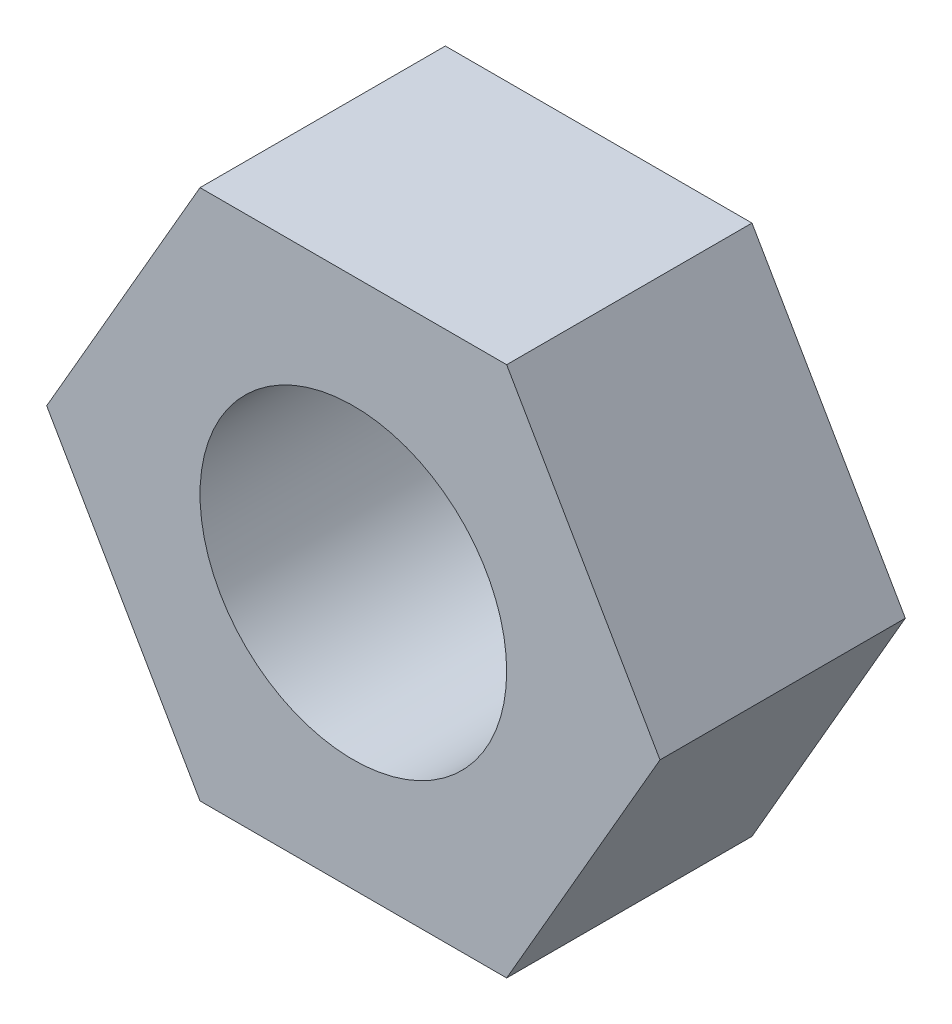
ISO-10303-21;
HEADER;
FILE_DESCRIPTION(('STEP AP214'),'2;1');
FILE_NAME('part.step','',(''),(''),'','','');
FILE_SCHEMA(('AUTOMOTIVE_DESIGN { 1 0 10303 214 1 1 1 1 }'));
ENDSEC;
DATA;
#1=APPLICATION_CONTEXT('core data for automotive mechanical design processes');
#2=APPLICATION_PROTOCOL_DEFINITION('international standard','automotive_design',2000,#1);
#3=PRODUCT_CONTEXT('',#1,'mechanical');
#4=PRODUCT('Part','Part','',(#3));
#5=PRODUCT_RELATED_PRODUCT_CATEGORY('part','',(#4));
#6=PRODUCT_DEFINITION_FORMATION('','',#4);
#7=PRODUCT_DEFINITION_CONTEXT('part definition',#1,'design');
#8=PRODUCT_DEFINITION('design','',#6,#7);
#9=PRODUCT_DEFINITION_SHAPE('','',#8);
#10=(LENGTH_UNIT() NAMED_UNIT(*) SI_UNIT(.MILLI.,.METRE.));
#11=(NAMED_UNIT(*) PLANE_ANGLE_UNIT() SI_UNIT($,.RADIAN.));
#12=(NAMED_UNIT(*) SI_UNIT($,.STERADIAN.) SOLID_ANGLE_UNIT());
#13=UNCERTAINTY_MEASURE_WITH_UNIT(LENGTH_MEASURE(1.E-05),#10,'distance_accuracy_value','');
#14=(GEOMETRIC_REPRESENTATION_CONTEXT(3) GLOBAL_UNCERTAINTY_ASSIGNED_CONTEXT((#13)) GLOBAL_UNIT_ASSIGNED_CONTEXT((#10,
#11,#12)) REPRESENTATION_CONTEXT('',''));
#15=CARTESIAN_POINT('',(0.,0.,0.));
#16=DIRECTION('',(0.,0.,1.));
#17=DIRECTION('',(1.,0.,0.));
#18=AXIS2_PLACEMENT_3D('',#15,#16,#17);
#19=CARTESIAN_POINT('',(2.50000000000005,-4.33012701892216,4.));
#20=DIRECTION('',(-0.866025403784442,0.499999999999995,0.));
#21=DIRECTION('',(-0.499999999999995,-0.866025403784442,0.));
#22=AXIS2_PLACEMENT_3D('',#19,#20,#21);
#23=PLANE('',#22);
#24=DIRECTION('',(0.499999999999995,0.866025403784442,0.));
#25=VECTOR('',#24,1.);
#26=CARTESIAN_POINT('',(2.50000000000005,-4.33012701892216,0.));
#27=LINE('',#26,#25);
#28=CARTESIAN_POINT('',(2.50000000000005,-4.33012701892216,0.));
#29=VERTEX_POINT('',#28);
#30=CARTESIAN_POINT('',(5.,0.,0.));
#31=VERTEX_POINT('',#30);
#32=EDGE_CURVE('E117',#29,#31,#27,.T.);
#33=ORIENTED_EDGE('',*,*,#32,.T.);
#34=DIRECTION('',(0.,0.,-1.));
#35=VECTOR('',#34,1.);
#36=CARTESIAN_POINT('',(5.,0.,4.));
#37=LINE('',#36,#35);
#38=CARTESIAN_POINT('',(5.,0.,4.));
#39=VERTEX_POINT('',#38);
#40=EDGE_CURVE('E11',#39,#31,#37,.T.);
#41=ORIENTED_EDGE('',*,*,#40,.F.);
#42=DIRECTION('',(0.499999999999995,0.866025403784442,0.));
#43=VECTOR('',#42,1.);
#44=CARTESIAN_POINT('',(2.50000000000005,-4.33012701892216,4.));
#45=LINE('',#44,#43);
#46=CARTESIAN_POINT('',(2.50000000000005,-4.33012701892216,4.));
#47=VERTEX_POINT('',#46);
#48=EDGE_CURVE('E128',#47,#39,#45,.T.);
#49=ORIENTED_EDGE('',*,*,#48,.F.);
#50=DIRECTION('',(0.,0.,-1.));
#51=VECTOR('',#50,1.);
#52=CARTESIAN_POINT('',(2.50000000000005,-4.33012701892216,4.));
#53=LINE('',#52,#51);
#54=EDGE_CURVE('E113',#47,#29,#53,.T.);
#55=ORIENTED_EDGE('',*,*,#54,.T.);
#56=EDGE_LOOP('',(#33,#41,#49,#55));
#57=FACE_BOUND('',#56,.T.);
#58=ADVANCED_FACE('F33',(#57),#23,.F.);
#59=CARTESIAN_POINT('',(5.,0.,4.));
#60=DIRECTION('',(-0.866025403784438,-0.500000000000001,0.));
#61=DIRECTION('',(0.500000000000001,-0.866025403784438,0.));
#62=AXIS2_PLACEMENT_3D('',#59,#60,#61);
#63=PLANE('',#62);
#64=DIRECTION('',(-0.500000000000001,0.866025403784438,0.));
#65=VECTOR('',#64,1.);
#66=CARTESIAN_POINT('',(5.,0.,0.));
#67=LINE('',#66,#65);
#68=CARTESIAN_POINT('',(2.49999999999999,4.3301270189222,0.));
#69=VERTEX_POINT('',#68);
#70=EDGE_CURVE('E120',#31,#69,#67,.T.);
#71=ORIENTED_EDGE('',*,*,#70,.T.);
#72=DIRECTION('',(0.,0.,-1.));
#73=VECTOR('',#72,1.);
#74=CARTESIAN_POINT('',(2.49999999999999,4.3301270189222,4.));
#75=LINE('',#74,#73);
#76=CARTESIAN_POINT('',(2.49999999999999,4.3301270189222,4.));
#77=VERTEX_POINT('',#76);
#78=EDGE_CURVE('E41',#77,#69,#75,.T.);
#79=ORIENTED_EDGE('',*,*,#78,.F.);
#80=DIRECTION('',(-0.500000000000001,0.866025403784438,0.));
#81=VECTOR('',#80,1.);
#82=CARTESIAN_POINT('',(5.,0.,4.));
#83=LINE('',#82,#81);
#84=EDGE_CURVE('E86',#39,#77,#83,.T.);
#85=ORIENTED_EDGE('',*,*,#84,.F.);
#86=ORIENTED_EDGE('',*,*,#40,.T.);
#87=EDGE_LOOP('',(#71,#79,#85,#86));
#88=FACE_BOUND('',#87,.T.);
#89=ADVANCED_FACE('F153',(#88),#63,.F.);
#90=CARTESIAN_POINT('',(2.49999999999999,4.3301270189222,4.));
#91=DIRECTION('',(0.,-1.,0.));
#92=DIRECTION('',(1.,0.,0.));
#93=AXIS2_PLACEMENT_3D('',#90,#91,#92);
#94=PLANE('',#93);
#95=DIRECTION('',(-1.,0.,0.));
#96=VECTOR('',#95,1.);
#97=CARTESIAN_POINT('',(2.49999999999999,4.3301270189222,0.));
#98=LINE('',#97,#96);
#99=CARTESIAN_POINT('',(-2.50000000000002,4.33012701892218,0.));
#100=VERTEX_POINT('',#99);
#101=EDGE_CURVE('E123',#69,#100,#98,.T.);
#102=ORIENTED_EDGE('',*,*,#101,.T.);
#103=DIRECTION('',(0.,0.,-1.));
#104=VECTOR('',#103,1.);
#105=CARTESIAN_POINT('',(-2.50000000000002,4.33012701892218,4.));
#106=LINE('',#105,#104);
#107=CARTESIAN_POINT('',(-2.50000000000002,4.33012701892218,4.));
#108=VERTEX_POINT('',#107);
#109=EDGE_CURVE('E108',#108,#100,#106,.T.);
#110=ORIENTED_EDGE('',*,*,#109,.F.);
#111=DIRECTION('',(-1.,0.,0.));
#112=VECTOR('',#111,1.);
#113=CARTESIAN_POINT('',(2.49999999999999,4.3301270189222,4.));
#114=LINE('',#113,#112);
#115=EDGE_CURVE('E99',#77,#108,#114,.T.);
#116=ORIENTED_EDGE('',*,*,#115,.F.);
#117=ORIENTED_EDGE('',*,*,#78,.T.);
#118=EDGE_LOOP('',(#102,#110,#116,#117));
#119=FACE_BOUND('',#118,.T.);
#120=ADVANCED_FACE('F134',(#119),#94,.F.);
#121=CARTESIAN_POINT('',(-2.50000000000002,4.33012701892218,4.));
#122=DIRECTION('',(0.866025403784441,-0.499999999999995,0.));
#123=DIRECTION('',(0.499999999999995,0.866025403784442,0.));
#124=AXIS2_PLACEMENT_3D('',#121,#122,#123);
#125=PLANE('',#124);
#126=DIRECTION('',(-0.499999999999995,-0.866025403784441,0.));
#127=VECTOR('',#126,1.);
#128=CARTESIAN_POINT('',(-2.50000000000002,4.33012701892218,0.));
#129=LINE('',#128,#127);
#130=CARTESIAN_POINT('',(-5.,0.,0.));
#131=VERTEX_POINT('',#130);
#132=EDGE_CURVE('E107',#100,#131,#129,.T.);
#133=ORIENTED_EDGE('',*,*,#132,.T.);
#134=DIRECTION('',(0.,0.,-1.));
#135=VECTOR('',#134,1.);
#136=CARTESIAN_POINT('',(-5.,0.,4.));
#137=LINE('',#136,#135);
#138=CARTESIAN_POINT('',(-5.,0.,4.));
#139=VERTEX_POINT('',#138);
#140=EDGE_CURVE('E104',#139,#131,#137,.T.);
#141=ORIENTED_EDGE('',*,*,#140,.F.);
#142=DIRECTION('',(-0.499999999999995,-0.866025403784441,0.));
#143=VECTOR('',#142,1.);
#144=CARTESIAN_POINT('',(-2.50000000000002,4.33012701892218,4.));
#145=LINE('',#144,#143);
#146=EDGE_CURVE('E93',#108,#139,#145,.T.);
#147=ORIENTED_EDGE('',*,*,#146,.F.);
#148=ORIENTED_EDGE('',*,*,#109,.T.);
#149=EDGE_LOOP('',(#133,#141,#147,#148));
#150=FACE_BOUND('',#149,.T.);
#151=ADVANCED_FACE('F105',(#150),#125,.F.);
#152=CARTESIAN_POINT('',(-5.,0.,4.));
#153=DIRECTION('',(0.866025403784434,0.500000000000007,0.));
#154=DIRECTION('',(-0.500000000000007,0.866025403784434,0.));
#155=AXIS2_PLACEMENT_3D('',#152,#153,#154);
#156=PLANE('',#155);
#157=DIRECTION('',(0.500000000000007,-0.866025403784434,0.));
#158=VECTOR('',#157,1.);
#159=CARTESIAN_POINT('',(-5.,0.,0.));
#160=LINE('',#159,#158);
#161=CARTESIAN_POINT('',(-2.49999999999996,-4.33012701892222,0.));
#162=VERTEX_POINT('',#161);
#163=EDGE_CURVE('E72',#131,#162,#160,.T.);
#164=ORIENTED_EDGE('',*,*,#163,.T.);
#165=DIRECTION('',(0.,0.,-1.));
#166=VECTOR('',#165,1.);
#167=CARTESIAN_POINT('',(-2.49999999999996,-4.33012701892222,4.));
#168=LINE('',#167,#166);
#169=CARTESIAN_POINT('',(-2.49999999999996,-4.33012701892222,4.));
#170=VERTEX_POINT('',#169);
#171=EDGE_CURVE('E109',#170,#162,#168,.T.);
#172=ORIENTED_EDGE('',*,*,#171,.F.);
#173=DIRECTION('',(0.500000000000007,-0.866025403784434,0.));
#174=VECTOR('',#173,1.);
#175=CARTESIAN_POINT('',(-5.,0.,4.));
#176=LINE('',#175,#174);
#177=EDGE_CURVE('E97',#139,#170,#176,.T.);
#178=ORIENTED_EDGE('',*,*,#177,.F.);
#179=ORIENTED_EDGE('',*,*,#140,.T.);
#180=EDGE_LOOP('',(#164,#172,#178,#179));
#181=FACE_BOUND('',#180,.T.);
#182=ADVANCED_FACE('F111',(#181),#156,.F.);
#183=CARTESIAN_POINT('',(-2.49999999999996,-4.33012701892222,4.));
#184=DIRECTION('',(0.,1.,0.));
#185=DIRECTION('',(-1.,0.,0.));
#186=AXIS2_PLACEMENT_3D('',#183,#184,#185);
#187=PLANE('',#186);
#188=DIRECTION('',(1.,0.,0.));
#189=VECTOR('',#188,1.);
#190=CARTESIAN_POINT('',(-2.49999999999996,-4.33012701892222,0.));
#191=LINE('',#190,#189);
#192=EDGE_CURVE('E78',#162,#29,#191,.T.);
#193=ORIENTED_EDGE('',*,*,#192,.T.);
#194=ORIENTED_EDGE('',*,*,#54,.F.);
#195=DIRECTION('',(1.,0.,0.));
#196=VECTOR('',#195,1.);
#197=CARTESIAN_POINT('',(-2.49999999999996,-4.33012701892222,4.));
#198=LINE('',#197,#196);
#199=EDGE_CURVE('E49',#170,#47,#198,.T.);
#200=ORIENTED_EDGE('',*,*,#199,.F.);
#201=ORIENTED_EDGE('',*,*,#171,.T.);
#202=EDGE_LOOP('',(#193,#194,#200,#201));
#203=FACE_BOUND('',#202,.T.);
#204=ADVANCED_FACE('F141',(#203),#187,.F.);
#205=CARTESIAN_POINT('',(0.,0.,4.));
#206=DIRECTION('',(0.,0.,1.));
#207=DIRECTION('',(1.,0.,0.));
#208=AXIS2_PLACEMENT_3D('',#205,#206,#207);
#209=PLANE('',#208);
#210=CARTESIAN_POINT('',(0.,0.,4.));
#211=DIRECTION('',(0.,0.,1.));
#212=DIRECTION('',(1.,0.,0.));
#213=AXIS2_PLACEMENT_3D('',#210,#211,#212);
#214=CIRCLE('',#213,2.5);
#215=CARTESIAN_POINT('',(2.5,0.,4.));
#216=VERTEX_POINT('',#215);
#217=EDGE_CURVE('E208',#216,#216,#214,.T.);
#218=ORIENTED_EDGE('',*,*,#217,.F.);
#219=EDGE_LOOP('',(#218));
#220=FACE_BOUND('',#219,.T.);
#221=ORIENTED_EDGE('',*,*,#48,.T.);
#222=ORIENTED_EDGE('',*,*,#84,.T.);
#223=ORIENTED_EDGE('',*,*,#115,.T.);
#224=ORIENTED_EDGE('',*,*,#146,.T.);
#225=ORIENTED_EDGE('',*,*,#177,.T.);
#226=ORIENTED_EDGE('',*,*,#199,.T.);
#227=EDGE_LOOP('',(#221,#222,#223,#224,#225,#226));
#228=FACE_BOUND('',#227,.T.);
#229=ADVANCED_FACE('F95',(#220,#228),#209,.T.);
#230=CARTESIAN_POINT('',(0.,0.,0.));
#231=DIRECTION('',(0.,0.,1.));
#232=DIRECTION('',(1.,0.,0.));
#233=AXIS2_PLACEMENT_3D('',#230,#231,#232);
#234=PLANE('',#233);
#235=CARTESIAN_POINT('',(0.,0.,0.));
#236=DIRECTION('',(0.,0.,1.));
#237=DIRECTION('',(1.,0.,0.));
#238=AXIS2_PLACEMENT_3D('',#235,#236,#237);
#239=CIRCLE('',#238,2.5);
#240=CARTESIAN_POINT('',(2.5,0.,0.));
#241=VERTEX_POINT('',#240);
#242=EDGE_CURVE('E121',#241,#241,#239,.T.);
#243=ORIENTED_EDGE('',*,*,#242,.T.);
#244=EDGE_LOOP('',(#243));
#245=FACE_BOUND('',#244,.T.);
#246=ORIENTED_EDGE('',*,*,#32,.F.);
#247=ORIENTED_EDGE('',*,*,#192,.F.);
#248=ORIENTED_EDGE('',*,*,#163,.F.);
#249=ORIENTED_EDGE('',*,*,#132,.F.);
#250=ORIENTED_EDGE('',*,*,#101,.F.);
#251=ORIENTED_EDGE('',*,*,#70,.F.);
#252=EDGE_LOOP('',(#246,#247,#248,#249,#250,#251));
#253=FACE_BOUND('',#252,.T.);
#254=ADVANCED_FACE('F137',(#245,#253),#234,.F.);
#255=CARTESIAN_POINT('',(0.,0.,0.));
#256=DIRECTION('',(0.,0.,1.));
#257=DIRECTION('',(1.,0.,0.));
#258=AXIS2_PLACEMENT_3D('',#255,#256,#257);
#259=CYLINDRICAL_SURFACE('',#258,2.5);
#260=ORIENTED_EDGE('',*,*,#242,.F.);
#261=EDGE_LOOP('',(#260));
#262=FACE_BOUND('',#261,.T.);
#263=ORIENTED_EDGE('',*,*,#217,.T.);
#264=EDGE_LOOP('',(#263));
#265=FACE_BOUND('',#264,.T.);
#266=ADVANCED_FACE('F190',(#262,#265),#259,.F.);
#267=CLOSED_SHELL('',(#58,#89,#120,#151,#182,#204,#229,#254,#266));
#268=MANIFOLD_SOLID_BREP('B2',#267);
#269=ADVANCED_BREP_SHAPE_REPRESENTATION('',(#18,#268),#14);
#270=SHAPE_DEFINITION_REPRESENTATION(#9,#269);
ENDSEC;
END-ISO-10303-21;
